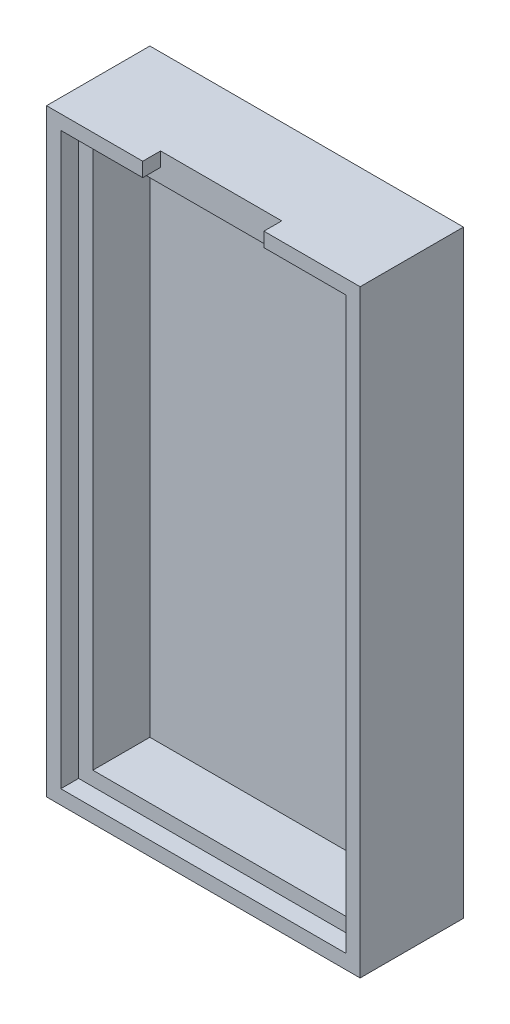
ISO-10303-21;
HEADER;
FILE_DESCRIPTION(('STEP AP214'),'2;1');
FILE_NAME('part.step','',(''),(''),'','','');
FILE_SCHEMA(('AUTOMOTIVE_DESIGN { 1 0 10303 214 1 1 1 1 }'));
ENDSEC;
DATA;
#1=APPLICATION_CONTEXT('core data for automotive mechanical design processes');
#2=APPLICATION_PROTOCOL_DEFINITION('international standard','automotive_design',2000,#1);
#3=PRODUCT_CONTEXT('',#1,'mechanical');
#4=PRODUCT('Part','Part','',(#3));
#5=PRODUCT_RELATED_PRODUCT_CATEGORY('part','',(#4));
#6=PRODUCT_DEFINITION_FORMATION('','',#4);
#7=PRODUCT_DEFINITION_CONTEXT('part definition',#1,'design');
#8=PRODUCT_DEFINITION('design','',#6,#7);
#9=PRODUCT_DEFINITION_SHAPE('','',#8);
#10=(LENGTH_UNIT() NAMED_UNIT(*) SI_UNIT(.MILLI.,.METRE.));
#11=(NAMED_UNIT(*) PLANE_ANGLE_UNIT() SI_UNIT($,.RADIAN.));
#12=(NAMED_UNIT(*) SI_UNIT($,.STERADIAN.) SOLID_ANGLE_UNIT());
#13=UNCERTAINTY_MEASURE_WITH_UNIT(LENGTH_MEASURE(1.E-05),#10,'distance_accuracy_value','');
#14=(GEOMETRIC_REPRESENTATION_CONTEXT(3) GLOBAL_UNCERTAINTY_ASSIGNED_CONTEXT((#13)) GLOBAL_UNIT_ASSIGNED_CONTEXT((#10,
#11,#12)) REPRESENTATION_CONTEXT('',''));
#15=CARTESIAN_POINT('',(0.,0.,0.));
#16=DIRECTION('',(0.,0.,1.));
#17=DIRECTION('',(1.,0.,0.));
#18=AXIS2_PLACEMENT_3D('',#15,#16,#17);
#19=CARTESIAN_POINT('',(-13.97,26.67,4.60375));
#20=DIRECTION('',(1.,0.,0.));
#21=DIRECTION('',(0.,0.,-1.));
#22=AXIS2_PLACEMENT_3D('',#19,#20,#21);
#23=PLANE('',#22);
#24=DIRECTION('',(0.,-1.,0.));
#25=VECTOR('',#24,1.);
#26=CARTESIAN_POINT('',(-13.97,26.67,-4.60375));
#27=LINE('',#26,#25);
#28=CARTESIAN_POINT('',(-13.97,26.67,-4.60375));
#29=VERTEX_POINT('',#28);
#30=CARTESIAN_POINT('',(-13.97,-26.67,-4.60375));
#31=VERTEX_POINT('',#30);
#32=EDGE_CURVE('E229',#29,#31,#27,.T.);
#33=ORIENTED_EDGE('',*,*,#32,.T.);
#34=DIRECTION('',(0.,0.,-1.));
#35=VECTOR('',#34,1.);
#36=CARTESIAN_POINT('',(-13.97,-26.67,4.60375));
#37=LINE('',#36,#35);
#38=CARTESIAN_POINT('',(-13.97,-26.67,4.60375));
#39=VERTEX_POINT('',#38);
#40=EDGE_CURVE('E40',#39,#31,#37,.T.);
#41=ORIENTED_EDGE('',*,*,#40,.F.);
#42=DIRECTION('',(0.,-1.,0.));
#43=VECTOR('',#42,1.);
#44=CARTESIAN_POINT('',(-13.97,26.67,4.60375));
#45=LINE('',#44,#43);
#46=CARTESIAN_POINT('',(-13.97,26.67,4.60375));
#47=VERTEX_POINT('',#46);
#48=EDGE_CURVE('E244',#47,#39,#45,.T.);
#49=ORIENTED_EDGE('',*,*,#48,.F.);
#50=DIRECTION('',(0.,0.,-1.));
#51=VECTOR('',#50,1.);
#52=CARTESIAN_POINT('',(-13.97,26.67,4.60375));
#53=LINE('',#52,#51);
#54=EDGE_CURVE('E252',#47,#29,#53,.T.);
#55=ORIENTED_EDGE('',*,*,#54,.T.);
#56=EDGE_LOOP('',(#33,#41,#49,#55));
#57=FACE_BOUND('',#56,.T.);
#58=ADVANCED_FACE('F33',(#57),#23,.F.);
#59=CARTESIAN_POINT('',(-13.97,-26.67,4.60375));
#60=DIRECTION('',(0.,1.,0.));
#61=DIRECTION('',(0.,0.,1.));
#62=AXIS2_PLACEMENT_3D('',#59,#60,#61);
#63=PLANE('',#62);
#64=DIRECTION('',(1.,0.,0.));
#65=VECTOR('',#64,1.);
#66=CARTESIAN_POINT('',(-13.97,-26.67,-4.60375));
#67=LINE('',#66,#65);
#68=CARTESIAN_POINT('',(13.97,-26.67,-4.60375));
#69=VERTEX_POINT('',#68);
#70=EDGE_CURVE('E255',#31,#69,#67,.T.);
#71=ORIENTED_EDGE('',*,*,#70,.T.);
#72=DIRECTION('',(0.,0.,-1.));
#73=VECTOR('',#72,1.);
#74=CARTESIAN_POINT('',(13.97,-26.67,4.60375));
#75=LINE('',#74,#73);
#76=CARTESIAN_POINT('',(13.97,-26.67,4.60375));
#77=VERTEX_POINT('',#76);
#78=EDGE_CURVE('E263',#77,#69,#75,.T.);
#79=ORIENTED_EDGE('',*,*,#78,.F.);
#80=DIRECTION('',(1.,0.,0.));
#81=VECTOR('',#80,1.);
#82=CARTESIAN_POINT('',(-13.97,-26.67,4.60375));
#83=LINE('',#82,#81);
#84=EDGE_CURVE('E85',#39,#77,#83,.T.);
#85=ORIENTED_EDGE('',*,*,#84,.F.);
#86=ORIENTED_EDGE('',*,*,#40,.T.);
#87=EDGE_LOOP('',(#71,#79,#85,#86));
#88=FACE_BOUND('',#87,.T.);
#89=ADVANCED_FACE('F266',(#88),#63,.F.);
#90=CARTESIAN_POINT('',(13.97,26.67,4.60375));
#91=DIRECTION('',(-1.,0.,0.));
#92=DIRECTION('',(0.,0.,1.));
#93=AXIS2_PLACEMENT_3D('',#90,#91,#92);
#94=PLANE('',#93);
#95=DIRECTION('',(0.,1.,0.));
#96=VECTOR('',#95,1.);
#97=CARTESIAN_POINT('',(13.97,26.67,-4.60375));
#98=LINE('',#97,#96);
#99=CARTESIAN_POINT('',(13.97,26.67,-4.60375));
#100=VERTEX_POINT('',#99);
#101=EDGE_CURVE('E257',#69,#100,#98,.T.);
#102=ORIENTED_EDGE('',*,*,#101,.T.);
#103=DIRECTION('',(0.,0.,-1.));
#104=VECTOR('',#103,1.);
#105=CARTESIAN_POINT('',(13.97,26.67,4.60375));
#106=LINE('',#105,#104);
#107=CARTESIAN_POINT('',(13.97,26.67,4.60375));
#108=VERTEX_POINT('',#107);
#109=EDGE_CURVE('E261',#108,#100,#106,.T.);
#110=ORIENTED_EDGE('',*,*,#109,.F.);
#111=DIRECTION('',(0.,1.,0.));
#112=VECTOR('',#111,1.);
#113=CARTESIAN_POINT('',(13.97,26.67,4.60375));
#114=LINE('',#113,#112);
#115=EDGE_CURVE('E247',#77,#108,#114,.T.);
#116=ORIENTED_EDGE('',*,*,#115,.F.);
#117=ORIENTED_EDGE('',*,*,#78,.T.);
#118=EDGE_LOOP('',(#102,#110,#116,#117));
#119=FACE_BOUND('',#118,.T.);
#120=ADVANCED_FACE('F275',(#119),#94,.F.);
#121=CARTESIAN_POINT('',(-13.97,26.67,4.60375));
#122=DIRECTION('',(0.,-1.,0.));
#123=DIRECTION('',(0.,0.,-1.));
#124=AXIS2_PLACEMENT_3D('',#121,#122,#123);
#125=PLANE('',#124);
#126=DIRECTION('',(-1.,0.,0.));
#127=VECTOR('',#126,1.);
#128=CARTESIAN_POINT('',(-5.3975,26.67,3.01625));
#129=LINE('',#128,#127);
#130=CARTESIAN_POINT('',(5.3975,26.67,3.01625));
#131=VERTEX_POINT('',#130);
#132=CARTESIAN_POINT('',(-5.3975,26.67,3.01625));
#133=VERTEX_POINT('',#132);
#134=EDGE_CURVE('E205',#131,#133,#129,.T.);
#135=ORIENTED_EDGE('',*,*,#134,.F.);
#136=DIRECTION('',(0.,0.,-1.));
#137=VECTOR('',#136,1.);
#138=CARTESIAN_POINT('',(5.3975,26.67,4.60375));
#139=LINE('',#138,#137);
#140=CARTESIAN_POINT('',(5.3975,26.67,4.60375));
#141=VERTEX_POINT('',#140);
#142=EDGE_CURVE('E209',#141,#131,#139,.T.);
#143=ORIENTED_EDGE('',*,*,#142,.F.);
#144=DIRECTION('',(-1.,0.,0.));
#145=VECTOR('',#144,1.);
#146=CARTESIAN_POINT('',(-13.97,26.67,4.60375));
#147=LINE('',#146,#145);
#148=EDGE_CURVE('E249',#108,#141,#147,.T.);
#149=ORIENTED_EDGE('',*,*,#148,.F.);
#150=ORIENTED_EDGE('',*,*,#109,.T.);
#151=DIRECTION('',(-1.,0.,0.));
#152=VECTOR('',#151,1.);
#153=CARTESIAN_POINT('',(-13.97,26.67,-4.60375));
#154=LINE('',#153,#152);
#155=EDGE_CURVE('E77',#100,#29,#154,.T.);
#156=ORIENTED_EDGE('',*,*,#155,.T.);
#157=ORIENTED_EDGE('',*,*,#54,.F.);
#158=CARTESIAN_POINT('',(-5.3975,26.67,4.60375));
#159=VERTEX_POINT('',#158);
#160=EDGE_CURVE('E55',#159,#47,#147,.T.);
#161=ORIENTED_EDGE('',*,*,#160,.F.);
#162=DIRECTION('',(0.,0.,1.));
#163=VECTOR('',#162,1.);
#164=CARTESIAN_POINT('',(-5.3975,26.67,4.60375));
#165=LINE('',#164,#163);
#166=EDGE_CURVE('E204',#133,#159,#165,.T.);
#167=ORIENTED_EDGE('',*,*,#166,.F.);
#168=EDGE_LOOP('',(#135,#143,#149,#150,#156,#157,#161,#167));
#169=FACE_BOUND('',#168,.T.);
#170=ADVANCED_FACE('F279',(#169),#125,.F.);
#171=CARTESIAN_POINT('',(0.,0.,4.60375));
#172=DIRECTION('',(0.,0.,1.));
#173=DIRECTION('',(1.,0.,0.));
#174=AXIS2_PLACEMENT_3D('',#171,#172,#173);
#175=PLANE('',#174);
#176=DIRECTION('',(-1.,0.,0.));
#177=VECTOR('',#176,1.);
#178=CARTESIAN_POINT('',(12.7,25.4,4.60375));
#179=LINE('',#178,#177);
#180=CARTESIAN_POINT('',(12.7,25.4,4.60375));
#181=VERTEX_POINT('',#180);
#182=CARTESIAN_POINT('',(5.3975,25.4,4.60375));
#183=VERTEX_POINT('',#182);
#184=EDGE_CURVE('E181',#181,#183,#179,.T.);
#185=ORIENTED_EDGE('',*,*,#184,.F.);
#186=DIRECTION('',(0.,1.,0.));
#187=VECTOR('',#186,1.);
#188=CARTESIAN_POINT('',(12.7,-25.4,4.60375));
#189=LINE('',#188,#187);
#190=CARTESIAN_POINT('',(12.7,-25.4,4.60375));
#191=VERTEX_POINT('',#190);
#192=EDGE_CURVE('E170',#191,#181,#189,.T.);
#193=ORIENTED_EDGE('',*,*,#192,.F.);
#194=DIRECTION('',(1.,0.,0.));
#195=VECTOR('',#194,1.);
#196=CARTESIAN_POINT('',(-12.7,-25.4,4.60375));
#197=LINE('',#196,#195);
#198=CARTESIAN_POINT('',(-12.7,-25.4,4.60375));
#199=VERTEX_POINT('',#198);
#200=EDGE_CURVE('E185',#199,#191,#197,.T.);
#201=ORIENTED_EDGE('',*,*,#200,.F.);
#202=DIRECTION('',(0.,-1.,0.));
#203=VECTOR('',#202,1.);
#204=CARTESIAN_POINT('',(-12.7,25.4,4.60375));
#205=LINE('',#204,#203);
#206=CARTESIAN_POINT('',(-12.7,25.4,4.60375));
#207=VERTEX_POINT('',#206);
#208=EDGE_CURVE('E178',#207,#199,#205,.T.);
#209=ORIENTED_EDGE('',*,*,#208,.F.);
#210=CARTESIAN_POINT('',(-5.3975,25.4,4.60375));
#211=VERTEX_POINT('',#210);
#212=EDGE_CURVE('E292',#211,#207,#179,.T.);
#213=ORIENTED_EDGE('',*,*,#212,.F.);
#214=DIRECTION('',(0.,1.,0.));
#215=VECTOR('',#214,1.);
#216=CARTESIAN_POINT('',(-5.3975,13.2188964238259,4.60375));
#217=LINE('',#216,#215);
#218=EDGE_CURVE('E219',#211,#159,#217,.T.);
#219=ORIENTED_EDGE('',*,*,#218,.T.);
#220=ORIENTED_EDGE('',*,*,#160,.T.);
#221=ORIENTED_EDGE('',*,*,#48,.T.);
#222=ORIENTED_EDGE('',*,*,#84,.T.);
#223=ORIENTED_EDGE('',*,*,#115,.T.);
#224=ORIENTED_EDGE('',*,*,#148,.T.);
#225=DIRECTION('',(0.,1.,0.));
#226=VECTOR('',#225,1.);
#227=CARTESIAN_POINT('',(5.3975,13.2188964238259,4.60375));
#228=LINE('',#227,#226);
#229=EDGE_CURVE('E208',#183,#141,#228,.T.);
#230=ORIENTED_EDGE('',*,*,#229,.F.);
#231=EDGE_LOOP('',(#185,#193,#201,#209,#213,#219,#220,#221,#222,#223,#224,#230));
#232=FACE_BOUND('',#231,.T.);
#233=ADVANCED_FACE('F282',(#232),#175,.T.);
#234=CARTESIAN_POINT('',(0.,0.,-4.60375));
#235=DIRECTION('',(0.,0.,1.));
#236=DIRECTION('',(1.,0.,0.));
#237=AXIS2_PLACEMENT_3D('',#234,#235,#236);
#238=PLANE('',#237);
#239=ORIENTED_EDGE('',*,*,#32,.F.);
#240=ORIENTED_EDGE('',*,*,#155,.F.);
#241=ORIENTED_EDGE('',*,*,#101,.F.);
#242=ORIENTED_EDGE('',*,*,#70,.F.);
#243=EDGE_LOOP('',(#239,#240,#241,#242));
#244=FACE_BOUND('',#243,.T.);
#245=ADVANCED_FACE('F271',(#244),#238,.F.);
#246=CARTESIAN_POINT('',(-11.43,26.67,4.60375));
#247=DIRECTION('',(1.,0.,0.));
#248=DIRECTION('',(0.,0.,-1.));
#249=AXIS2_PLACEMENT_3D('',#246,#247,#248);
#250=PLANE('',#249);
#251=DIRECTION('',(0.,1.,0.));
#252=VECTOR('',#251,1.);
#253=CARTESIAN_POINT('',(-11.43,26.67,3.01625));
#254=LINE('',#253,#252);
#255=CARTESIAN_POINT('',(-11.43,-24.13,3.01625));
#256=VERTEX_POINT('',#255);
#257=CARTESIAN_POINT('',(-11.43,24.13,3.01625));
#258=VERTEX_POINT('',#257);
#259=EDGE_CURVE('E201',#256,#258,#254,.T.);
#260=ORIENTED_EDGE('',*,*,#259,.F.);
#261=DIRECTION('',(0.,0.,-1.));
#262=VECTOR('',#261,1.);
#263=CARTESIAN_POINT('',(-11.43,-24.13,4.60375));
#264=LINE('',#263,#262);
#265=CARTESIAN_POINT('',(-11.43,-24.13,-2.06375));
#266=VERTEX_POINT('',#265);
#267=EDGE_CURVE('E227',#256,#266,#264,.T.);
#268=ORIENTED_EDGE('',*,*,#267,.T.);
#269=DIRECTION('',(0.,-1.,0.));
#270=VECTOR('',#269,1.);
#271=CARTESIAN_POINT('',(-11.43,26.67,-2.06375));
#272=LINE('',#271,#270);
#273=CARTESIAN_POINT('',(-11.43,24.13,-2.06375));
#274=VERTEX_POINT('',#273);
#275=EDGE_CURVE('E223',#274,#266,#272,.T.);
#276=ORIENTED_EDGE('',*,*,#275,.F.);
#277=DIRECTION('',(0.,0.,-1.));
#278=VECTOR('',#277,1.);
#279=CARTESIAN_POINT('',(-11.43,24.13,4.60375));
#280=LINE('',#279,#278);
#281=EDGE_CURVE('E231',#258,#274,#280,.T.);
#282=ORIENTED_EDGE('',*,*,#281,.F.);
#283=EDGE_LOOP('',(#260,#268,#276,#282));
#284=FACE_BOUND('',#283,.T.);
#285=ADVANCED_FACE('F325',(#284),#250,.T.);
#286=CARTESIAN_POINT('',(-13.97,-24.13,4.60375));
#287=DIRECTION('',(0.,1.,0.));
#288=DIRECTION('',(0.,0.,1.));
#289=AXIS2_PLACEMENT_3D('',#286,#287,#288);
#290=PLANE('',#289);
#291=DIRECTION('',(-1.,0.,0.));
#292=VECTOR('',#291,1.);
#293=CARTESIAN_POINT('',(-13.97,-24.13,3.01625));
#294=LINE('',#293,#292);
#295=CARTESIAN_POINT('',(11.43,-24.13,3.01625));
#296=VERTEX_POINT('',#295);
#297=EDGE_CURVE('E199',#296,#256,#294,.T.);
#298=ORIENTED_EDGE('',*,*,#297,.F.);
#299=DIRECTION('',(0.,0.,-1.));
#300=VECTOR('',#299,1.);
#301=CARTESIAN_POINT('',(11.43,-24.13,4.60375));
#302=LINE('',#301,#300);
#303=CARTESIAN_POINT('',(11.43,-24.13,-2.06375));
#304=VERTEX_POINT('',#303);
#305=EDGE_CURVE('E230',#296,#304,#302,.T.);
#306=ORIENTED_EDGE('',*,*,#305,.T.);
#307=DIRECTION('',(1.,0.,0.));
#308=VECTOR('',#307,1.);
#309=CARTESIAN_POINT('',(-13.97,-24.13,-2.06375));
#310=LINE('',#309,#308);
#311=EDGE_CURVE('E226',#266,#304,#310,.T.);
#312=ORIENTED_EDGE('',*,*,#311,.F.);
#313=ORIENTED_EDGE('',*,*,#267,.F.);
#314=EDGE_LOOP('',(#298,#306,#312,#313));
#315=FACE_BOUND('',#314,.T.);
#316=ADVANCED_FACE('F339',(#315),#290,.T.);
#317=CARTESIAN_POINT('',(11.43,26.67,4.60375));
#318=DIRECTION('',(-1.,0.,0.));
#319=DIRECTION('',(0.,0.,1.));
#320=AXIS2_PLACEMENT_3D('',#317,#318,#319);
#321=PLANE('',#320);
#322=DIRECTION('',(0.,-1.,0.));
#323=VECTOR('',#322,1.);
#324=CARTESIAN_POINT('',(11.43,26.67,3.01625));
#325=LINE('',#324,#323);
#326=CARTESIAN_POINT('',(11.43,24.13,3.01625));
#327=VERTEX_POINT('',#326);
#328=EDGE_CURVE('E197',#327,#296,#325,.T.);
#329=ORIENTED_EDGE('',*,*,#328,.F.);
#330=DIRECTION('',(0.,0.,-1.));
#331=VECTOR('',#330,1.);
#332=CARTESIAN_POINT('',(11.43,24.13,4.60375));
#333=LINE('',#332,#331);
#334=CARTESIAN_POINT('',(11.43,24.13,-2.06375));
#335=VERTEX_POINT('',#334);
#336=EDGE_CURVE('E233',#327,#335,#333,.T.);
#337=ORIENTED_EDGE('',*,*,#336,.T.);
#338=DIRECTION('',(0.,1.,0.));
#339=VECTOR('',#338,1.);
#340=CARTESIAN_POINT('',(11.43,26.67,-2.06375));
#341=LINE('',#340,#339);
#342=EDGE_CURVE('E237',#304,#335,#341,.T.);
#343=ORIENTED_EDGE('',*,*,#342,.F.);
#344=ORIENTED_EDGE('',*,*,#305,.F.);
#345=EDGE_LOOP('',(#329,#337,#343,#344));
#346=FACE_BOUND('',#345,.T.);
#347=ADVANCED_FACE('F335',(#346),#321,.T.);
#348=CARTESIAN_POINT('',(-13.97,24.13,4.60375));
#349=DIRECTION('',(0.,-1.,0.));
#350=DIRECTION('',(0.,0.,-1.));
#351=AXIS2_PLACEMENT_3D('',#348,#349,#350);
#352=PLANE('',#351);
#353=DIRECTION('',(-1.,0.,0.));
#354=VECTOR('',#353,1.);
#355=CARTESIAN_POINT('',(-5.3975,24.13,3.01625));
#356=LINE('',#355,#354);
#357=EDGE_CURVE('E214',#327,#258,#356,.T.);
#358=ORIENTED_EDGE('',*,*,#357,.T.);
#359=ORIENTED_EDGE('',*,*,#281,.T.);
#360=DIRECTION('',(-1.,0.,0.));
#361=VECTOR('',#360,1.);
#362=CARTESIAN_POINT('',(-13.97,24.13,-2.06375));
#363=LINE('',#362,#361);
#364=EDGE_CURVE('E234',#335,#274,#363,.T.);
#365=ORIENTED_EDGE('',*,*,#364,.F.);
#366=ORIENTED_EDGE('',*,*,#336,.F.);
#367=EDGE_LOOP('',(#358,#359,#365,#366));
#368=FACE_BOUND('',#367,.T.);
#369=ADVANCED_FACE('F331',(#368),#352,.T.);
#370=CARTESIAN_POINT('',(0.,0.,-2.06375));
#371=DIRECTION('',(0.,0.,1.));
#372=DIRECTION('',(1.,0.,0.));
#373=AXIS2_PLACEMENT_3D('',#370,#371,#372);
#374=PLANE('',#373);
#375=ORIENTED_EDGE('',*,*,#275,.T.);
#376=ORIENTED_EDGE('',*,*,#311,.T.);
#377=ORIENTED_EDGE('',*,*,#342,.T.);
#378=ORIENTED_EDGE('',*,*,#364,.T.);
#379=EDGE_LOOP('',(#375,#376,#377,#378));
#380=FACE_BOUND('',#379,.T.);
#381=ADVANCED_FACE('F328',(#380),#374,.T.);
#382=CARTESIAN_POINT('',(5.3975,13.2188964238259,4.60375));
#383=DIRECTION('',(1.,0.,0.));
#384=DIRECTION('',(0.,0.,-1.));
#385=AXIS2_PLACEMENT_3D('',#382,#383,#384);
#386=PLANE('',#385);
#387=DIRECTION('',(0.,1.,0.));
#388=VECTOR('',#387,1.);
#389=CARTESIAN_POINT('',(5.3975,13.2188964238259,3.01625));
#390=LINE('',#389,#388);
#391=CARTESIAN_POINT('',(5.3975,25.4,3.01625));
#392=VERTEX_POINT('',#391);
#393=EDGE_CURVE('E217',#392,#131,#390,.T.);
#394=ORIENTED_EDGE('',*,*,#393,.F.);
#395=DIRECTION('',(0.,0.,1.));
#396=VECTOR('',#395,1.);
#397=CARTESIAN_POINT('',(5.3975,25.4,4.60375));
#398=LINE('',#397,#396);
#399=EDGE_CURVE('E159',#392,#183,#398,.T.);
#400=ORIENTED_EDGE('',*,*,#399,.T.);
#401=ORIENTED_EDGE('',*,*,#229,.T.);
#402=ORIENTED_EDGE('',*,*,#142,.T.);
#403=EDGE_LOOP('',(#394,#400,#401,#402));
#404=FACE_BOUND('',#403,.T.);
#405=ADVANCED_FACE('F284',(#404),#386,.F.);
#406=CARTESIAN_POINT('',(-5.3975,13.2188964238259,3.01625));
#407=DIRECTION('',(0.,0.,-1.));
#408=DIRECTION('',(-1.,0.,0.));
#409=AXIS2_PLACEMENT_3D('',#406,#407,#408);
#410=PLANE('',#409);
#411=DIRECTION('',(-1.,0.,0.));
#412=VECTOR('',#411,1.);
#413=CARTESIAN_POINT('',(12.7,25.4,3.01625));
#414=LINE('',#413,#412);
#415=CARTESIAN_POINT('',(12.7,25.4,3.01625));
#416=VERTEX_POINT('',#415);
#417=EDGE_CURVE('E153',#416,#392,#414,.T.);
#418=ORIENTED_EDGE('',*,*,#417,.T.);
#419=ORIENTED_EDGE('',*,*,#393,.T.);
#420=ORIENTED_EDGE('',*,*,#134,.T.);
#421=DIRECTION('',(0.,1.,0.));
#422=VECTOR('',#421,1.);
#423=CARTESIAN_POINT('',(-5.3975,13.2188964238259,3.01625));
#424=LINE('',#423,#422);
#425=CARTESIAN_POINT('',(-5.3975,25.4,3.01625));
#426=VERTEX_POINT('',#425);
#427=EDGE_CURVE('E216',#426,#133,#424,.T.);
#428=ORIENTED_EDGE('',*,*,#427,.F.);
#429=CARTESIAN_POINT('',(-12.7,25.4,3.01625));
#430=VERTEX_POINT('',#429);
#431=EDGE_CURVE('E47',#426,#430,#414,.T.);
#432=ORIENTED_EDGE('',*,*,#431,.T.);
#433=DIRECTION('',(0.,-1.,0.));
#434=VECTOR('',#433,1.);
#435=CARTESIAN_POINT('',(-12.7,25.4,3.01625));
#436=LINE('',#435,#434);
#437=CARTESIAN_POINT('',(-12.7,-25.4,3.01625));
#438=VERTEX_POINT('',#437);
#439=EDGE_CURVE('E190',#430,#438,#436,.T.);
#440=ORIENTED_EDGE('',*,*,#439,.T.);
#441=DIRECTION('',(1.,0.,0.));
#442=VECTOR('',#441,1.);
#443=CARTESIAN_POINT('',(-12.7,-25.4,3.01625));
#444=LINE('',#443,#442);
#445=CARTESIAN_POINT('',(12.7,-25.4,3.01625));
#446=VERTEX_POINT('',#445);
#447=EDGE_CURVE('E176',#438,#446,#444,.T.);
#448=ORIENTED_EDGE('',*,*,#447,.T.);
#449=DIRECTION('',(0.,1.,0.));
#450=VECTOR('',#449,1.);
#451=CARTESIAN_POINT('',(12.7,-25.4,3.01625));
#452=LINE('',#451,#450);
#453=EDGE_CURVE('E167',#446,#416,#452,.T.);
#454=ORIENTED_EDGE('',*,*,#453,.T.);
#455=EDGE_LOOP('',(#418,#419,#420,#428,#432,#440,#448,#454));
#456=FACE_BOUND('',#455,.T.);
#457=ORIENTED_EDGE('',*,*,#357,.F.);
#458=ORIENTED_EDGE('',*,*,#328,.T.);
#459=ORIENTED_EDGE('',*,*,#297,.T.);
#460=ORIENTED_EDGE('',*,*,#259,.T.);
#461=EDGE_LOOP('',(#457,#458,#459,#460));
#462=FACE_BOUND('',#461,.T.);
#463=ADVANCED_FACE('F173',(#456,#462),#410,.F.);
#464=CARTESIAN_POINT('',(-5.3975,13.2188964238259,4.60375));
#465=DIRECTION('',(-1.,0.,0.));
#466=DIRECTION('',(0.,0.,1.));
#467=AXIS2_PLACEMENT_3D('',#464,#465,#466);
#468=PLANE('',#467);
#469=ORIENTED_EDGE('',*,*,#218,.F.);
#470=DIRECTION('',(0.,0.,-1.));
#471=VECTOR('',#470,1.);
#472=CARTESIAN_POINT('',(-5.3975,25.4,4.60375));
#473=LINE('',#472,#471);
#474=EDGE_CURVE('E11',#211,#426,#473,.T.);
#475=ORIENTED_EDGE('',*,*,#474,.T.);
#476=ORIENTED_EDGE('',*,*,#427,.T.);
#477=ORIENTED_EDGE('',*,*,#166,.T.);
#478=EDGE_LOOP('',(#469,#475,#476,#477));
#479=FACE_BOUND('',#478,.T.);
#480=ADVANCED_FACE('F289',(#479),#468,.F.);
#481=CARTESIAN_POINT('',(12.7,25.4,-53.7798766284947));
#482=DIRECTION('',(0.,1.,0.));
#483=DIRECTION('',(0.,0.,1.));
#484=AXIS2_PLACEMENT_3D('',#481,#482,#483);
#485=PLANE('',#484);
#486=ORIENTED_EDGE('',*,*,#417,.F.);
#487=DIRECTION('',(0.,0.,1.));
#488=VECTOR('',#487,1.);
#489=CARTESIAN_POINT('',(12.7,25.4,-53.7798766284947));
#490=LINE('',#489,#488);
#491=EDGE_CURVE('E156',#416,#181,#490,.T.);
#492=ORIENTED_EDGE('',*,*,#491,.T.);
#493=ORIENTED_EDGE('',*,*,#184,.T.);
#494=ORIENTED_EDGE('',*,*,#399,.F.);
#495=EDGE_LOOP('',(#486,#492,#493,#494));
#496=FACE_BOUND('',#495,.T.);
#497=ADVANCED_FACE('F155',(#496),#485,.F.);
#498=ORIENTED_EDGE('',*,*,#212,.T.);
#499=DIRECTION('',(0.,0.,1.));
#500=VECTOR('',#499,1.);
#501=CARTESIAN_POINT('',(-12.7,25.4,-53.7798766284947));
#502=LINE('',#501,#500);
#503=EDGE_CURVE('E163',#430,#207,#502,.T.);
#504=ORIENTED_EDGE('',*,*,#503,.F.);
#505=ORIENTED_EDGE('',*,*,#431,.F.);
#506=ORIENTED_EDGE('',*,*,#474,.F.);
#507=EDGE_LOOP('',(#498,#504,#505,#506));
#508=FACE_BOUND('',#507,.T.);
#509=ADVANCED_FACE('F291',(#508),#485,.F.);
#510=CARTESIAN_POINT('',(12.7,-25.4,-53.7798766284947));
#511=DIRECTION('',(1.,0.,0.));
#512=DIRECTION('',(0.,0.,-1.));
#513=AXIS2_PLACEMENT_3D('',#510,#511,#512);
#514=PLANE('',#513);
#515=DIRECTION('',(0.,0.,1.));
#516=VECTOR('',#515,1.);
#517=CARTESIAN_POINT('',(12.7,-25.4,-53.7798766284947));
#518=LINE('',#517,#516);
#519=EDGE_CURVE('E188',#446,#191,#518,.T.);
#520=ORIENTED_EDGE('',*,*,#519,.T.);
#521=ORIENTED_EDGE('',*,*,#192,.T.);
#522=ORIENTED_EDGE('',*,*,#491,.F.);
#523=ORIENTED_EDGE('',*,*,#453,.F.);
#524=EDGE_LOOP('',(#520,#521,#522,#523));
#525=FACE_BOUND('',#524,.T.);
#526=ADVANCED_FACE('F166',(#525),#514,.F.);
#527=CARTESIAN_POINT('',(-12.7,25.4,-53.7798766284947));
#528=DIRECTION('',(-1.,0.,0.));
#529=DIRECTION('',(0.,0.,1.));
#530=AXIS2_PLACEMENT_3D('',#527,#528,#529);
#531=PLANE('',#530);
#532=ORIENTED_EDGE('',*,*,#503,.T.);
#533=ORIENTED_EDGE('',*,*,#208,.T.);
#534=DIRECTION('',(0.,0.,1.));
#535=VECTOR('',#534,1.);
#536=CARTESIAN_POINT('',(-12.7,-25.4,-53.7798766284947));
#537=LINE('',#536,#535);
#538=EDGE_CURVE('E189',#438,#199,#537,.T.);
#539=ORIENTED_EDGE('',*,*,#538,.F.);
#540=ORIENTED_EDGE('',*,*,#439,.F.);
#541=EDGE_LOOP('',(#532,#533,#539,#540));
#542=FACE_BOUND('',#541,.T.);
#543=ADVANCED_FACE('F302',(#542),#531,.F.);
#544=CARTESIAN_POINT('',(-12.7,-25.4,-53.7798766284947));
#545=DIRECTION('',(0.,-1.,0.));
#546=DIRECTION('',(0.,0.,-1.));
#547=AXIS2_PLACEMENT_3D('',#544,#545,#546);
#548=PLANE('',#547);
#549=ORIENTED_EDGE('',*,*,#538,.T.);
#550=ORIENTED_EDGE('',*,*,#200,.T.);
#551=ORIENTED_EDGE('',*,*,#519,.F.);
#552=ORIENTED_EDGE('',*,*,#447,.F.);
#553=EDGE_LOOP('',(#549,#550,#551,#552));
#554=FACE_BOUND('',#553,.T.);
#555=ADVANCED_FACE('F298',(#554),#548,.F.);
#556=CLOSED_SHELL('',(#58,#89,#120,#170,#233,#245,#285,#316,#347,#369,#381,#405,#463,#480,#497,
#509,#526,#543,#555));
#557=MANIFOLD_SOLID_BREP('B2',#556);
#558=ADVANCED_BREP_SHAPE_REPRESENTATION('',(#18,#557),#14);
#559=SHAPE_DEFINITION_REPRESENTATION(#9,#558);
ENDSEC;
END-ISO-10303-21;
